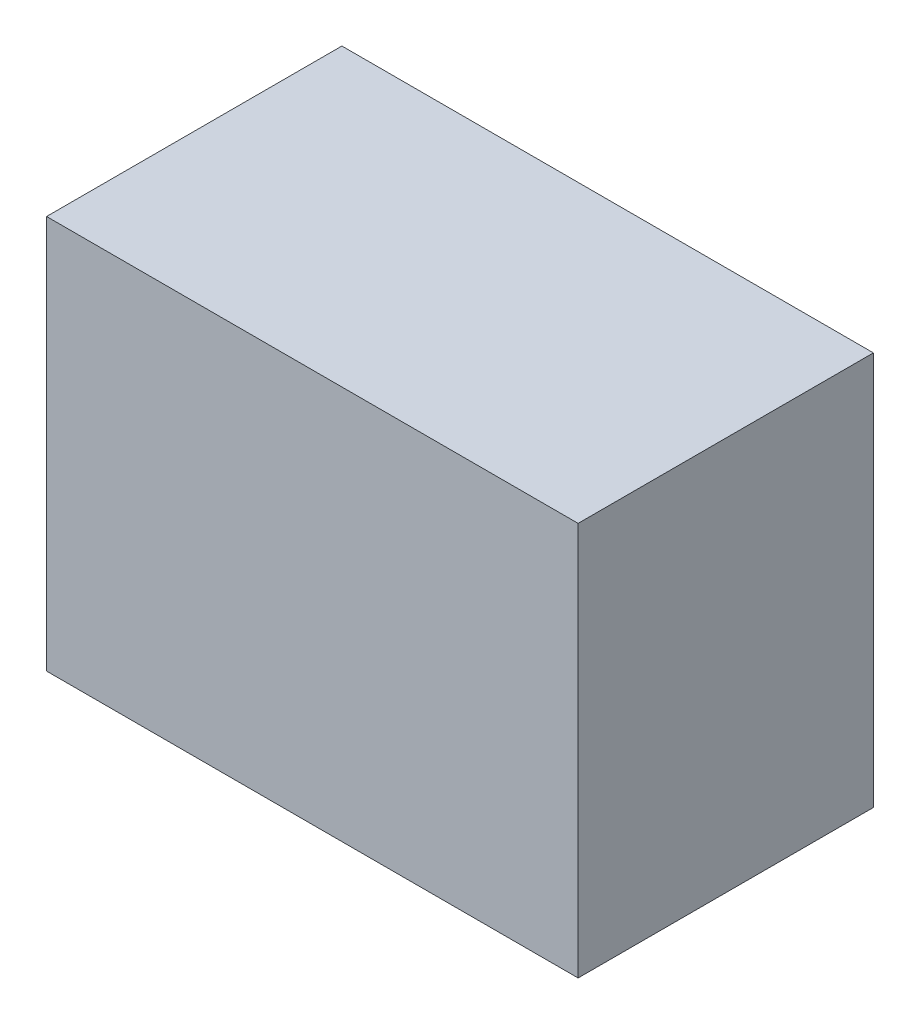
ISO-10303-21;
HEADER;
FILE_DESCRIPTION(('STEP AP214'),'2;1');
FILE_NAME('part.step','',(''),(''),'','','');
FILE_SCHEMA(('AUTOMOTIVE_DESIGN { 1 0 10303 214 1 1 1 1 }'));
ENDSEC;
DATA;
#1=APPLICATION_CONTEXT('core data for automotive mechanical design processes');
#2=APPLICATION_PROTOCOL_DEFINITION('international standard','automotive_design',2000,#1);
#3=PRODUCT_CONTEXT('',#1,'mechanical');
#4=PRODUCT('Part','Part','',(#3));
#5=PRODUCT_RELATED_PRODUCT_CATEGORY('part','',(#4));
#6=PRODUCT_DEFINITION_FORMATION('','',#4);
#7=PRODUCT_DEFINITION_CONTEXT('part definition',#1,'design');
#8=PRODUCT_DEFINITION('design','',#6,#7);
#9=PRODUCT_DEFINITION_SHAPE('','',#8);
#10=(LENGTH_UNIT() NAMED_UNIT(*) SI_UNIT(.MILLI.,.METRE.));
#11=(NAMED_UNIT(*) PLANE_ANGLE_UNIT() SI_UNIT($,.RADIAN.));
#12=(NAMED_UNIT(*) SI_UNIT($,.STERADIAN.) SOLID_ANGLE_UNIT());
#13=UNCERTAINTY_MEASURE_WITH_UNIT(LENGTH_MEASURE(1.E-05),#10,'distance_accuracy_value','');
#14=(GEOMETRIC_REPRESENTATION_CONTEXT(3) GLOBAL_UNCERTAINTY_ASSIGNED_CONTEXT((#13)) GLOBAL_UNIT_ASSIGNED_CONTEXT((#10,
#11,#12)) REPRESENTATION_CONTEXT('',''));
#15=CARTESIAN_POINT('',(0.,0.,0.));
#16=DIRECTION('',(0.,0.,1.));
#17=DIRECTION('',(1.,0.,0.));
#18=AXIS2_PLACEMENT_3D('',#15,#16,#17);
#19=CARTESIAN_POINT('',(-135.,191.758567393963,-75.));
#20=DIRECTION('',(1.,0.,0.));
#21=DIRECTION('',(0.,0.,-1.));
#22=AXIS2_PLACEMENT_3D('',#19,#20,#21);
#23=PLANE('',#22);
#24=DIRECTION('',(0.,0.,1.));
#25=VECTOR('',#24,1.);
#26=CARTESIAN_POINT('',(-135.,-8.24143260603705,-75.));
#27=LINE('',#26,#25);
#28=CARTESIAN_POINT('',(-135.,-8.24143260603705,-75.));
#29=VERTEX_POINT('',#28);
#30=CARTESIAN_POINT('',(-135.,-8.24143260603705,75.));
#31=VERTEX_POINT('',#30);
#32=EDGE_CURVE('E101',#29,#31,#27,.T.);
#33=ORIENTED_EDGE('',*,*,#32,.T.);
#34=DIRECTION('',(0.,-1.,0.));
#35=VECTOR('',#34,1.);
#36=CARTESIAN_POINT('',(-135.,191.758567393963,75.));
#37=LINE('',#36,#35);
#38=CARTESIAN_POINT('',(-135.,191.758567393963,75.));
#39=VERTEX_POINT('',#38);
#40=EDGE_CURVE('E11',#39,#31,#37,.T.);
#41=ORIENTED_EDGE('',*,*,#40,.F.);
#42=DIRECTION('',(0.,0.,1.));
#43=VECTOR('',#42,1.);
#44=CARTESIAN_POINT('',(-135.,191.758567393963,-75.));
#45=LINE('',#44,#43);
#46=CARTESIAN_POINT('',(-135.,191.758567393963,-75.));
#47=VERTEX_POINT('',#46);
#48=EDGE_CURVE('E89',#47,#39,#45,.T.);
#49=ORIENTED_EDGE('',*,*,#48,.F.);
#50=DIRECTION('',(0.,-1.,0.));
#51=VECTOR('',#50,1.);
#52=CARTESIAN_POINT('',(-135.,191.758567393963,-75.));
#53=LINE('',#52,#51);
#54=EDGE_CURVE('E97',#47,#29,#53,.T.);
#55=ORIENTED_EDGE('',*,*,#54,.T.);
#56=EDGE_LOOP('',(#33,#41,#49,#55));
#57=FACE_BOUND('',#56,.T.);
#58=ADVANCED_FACE('F38',(#57),#23,.F.);
#59=CARTESIAN_POINT('',(135.,191.758567393963,75.));
#60=DIRECTION('',(0.,0.,-1.));
#61=DIRECTION('',(-1.,0.,0.));
#62=AXIS2_PLACEMENT_3D('',#59,#60,#61);
#63=PLANE('',#62);
#64=DIRECTION('',(1.,0.,0.));
#65=VECTOR('',#64,1.);
#66=CARTESIAN_POINT('',(135.,-8.24143260603705,75.));
#67=LINE('',#66,#65);
#68=CARTESIAN_POINT('',(135.,-8.24143260603705,75.));
#69=VERTEX_POINT('',#68);
#70=EDGE_CURVE('E93',#31,#69,#67,.T.);
#71=ORIENTED_EDGE('',*,*,#70,.T.);
#72=DIRECTION('',(0.,-1.,0.));
#73=VECTOR('',#72,1.);
#74=CARTESIAN_POINT('',(135.,191.758567393963,75.));
#75=LINE('',#74,#73);
#76=CARTESIAN_POINT('',(135.,191.758567393963,75.));
#77=VERTEX_POINT('',#76);
#78=EDGE_CURVE('E46',#77,#69,#75,.T.);
#79=ORIENTED_EDGE('',*,*,#78,.F.);
#80=DIRECTION('',(1.,0.,0.));
#81=VECTOR('',#80,1.);
#82=CARTESIAN_POINT('',(135.,191.758567393963,75.));
#83=LINE('',#82,#81);
#84=EDGE_CURVE('E84',#39,#77,#83,.T.);
#85=ORIENTED_EDGE('',*,*,#84,.F.);
#86=ORIENTED_EDGE('',*,*,#40,.T.);
#87=EDGE_LOOP('',(#71,#79,#85,#86));
#88=FACE_BOUND('',#87,.T.);
#89=ADVANCED_FACE('F92',(#88),#63,.F.);
#90=CARTESIAN_POINT('',(135.,191.758567393963,-75.));
#91=DIRECTION('',(-1.,0.,0.));
#92=DIRECTION('',(0.,0.,1.));
#93=AXIS2_PLACEMENT_3D('',#90,#91,#92);
#94=PLANE('',#93);
#95=DIRECTION('',(0.,0.,-1.));
#96=VECTOR('',#95,1.);
#97=CARTESIAN_POINT('',(135.,-8.24143260603705,-75.));
#98=LINE('',#97,#96);
#99=CARTESIAN_POINT('',(135.,-8.24143260603705,-75.));
#100=VERTEX_POINT('',#99);
#101=EDGE_CURVE('E71',#69,#100,#98,.T.);
#102=ORIENTED_EDGE('',*,*,#101,.T.);
#103=DIRECTION('',(0.,-1.,0.));
#104=VECTOR('',#103,1.);
#105=CARTESIAN_POINT('',(135.,191.758567393963,-75.));
#106=LINE('',#105,#104);
#107=CARTESIAN_POINT('',(135.,191.758567393963,-75.));
#108=VERTEX_POINT('',#107);
#109=EDGE_CURVE('E94',#108,#100,#106,.T.);
#110=ORIENTED_EDGE('',*,*,#109,.F.);
#111=DIRECTION('',(0.,0.,-1.));
#112=VECTOR('',#111,1.);
#113=CARTESIAN_POINT('',(135.,191.758567393963,-75.));
#114=LINE('',#113,#112);
#115=EDGE_CURVE('E87',#77,#108,#114,.T.);
#116=ORIENTED_EDGE('',*,*,#115,.F.);
#117=ORIENTED_EDGE('',*,*,#78,.T.);
#118=EDGE_LOOP('',(#102,#110,#116,#117));
#119=FACE_BOUND('',#118,.T.);
#120=ADVANCED_FACE('F95',(#119),#94,.F.);
#121=CARTESIAN_POINT('',(135.,191.758567393963,-75.));
#122=DIRECTION('',(0.,0.,1.));
#123=DIRECTION('',(1.,0.,0.));
#124=AXIS2_PLACEMENT_3D('',#121,#122,#123);
#125=PLANE('',#124);
#126=DIRECTION('',(-1.,0.,0.));
#127=VECTOR('',#126,1.);
#128=CARTESIAN_POINT('',(135.,-8.24143260603705,-75.));
#129=LINE('',#128,#127);
#130=EDGE_CURVE('E77',#100,#29,#129,.T.);
#131=ORIENTED_EDGE('',*,*,#130,.T.);
#132=ORIENTED_EDGE('',*,*,#54,.F.);
#133=DIRECTION('',(-1.,0.,0.));
#134=VECTOR('',#133,1.);
#135=CARTESIAN_POINT('',(135.,191.758567393963,-75.));
#136=LINE('',#135,#134);
#137=EDGE_CURVE('E54',#108,#47,#136,.T.);
#138=ORIENTED_EDGE('',*,*,#137,.F.);
#139=ORIENTED_EDGE('',*,*,#109,.T.);
#140=EDGE_LOOP('',(#131,#132,#138,#139));
#141=FACE_BOUND('',#140,.T.);
#142=ADVANCED_FACE('F108',(#141),#125,.F.);
#143=CARTESIAN_POINT('',(0.,191.758567393963,0.));
#144=DIRECTION('',(0.,-1.,0.));
#145=DIRECTION('',(0.,0.,-1.));
#146=AXIS2_PLACEMENT_3D('',#143,#144,#145);
#147=PLANE('',#146);
#148=ORIENTED_EDGE('',*,*,#48,.T.);
#149=ORIENTED_EDGE('',*,*,#84,.T.);
#150=ORIENTED_EDGE('',*,*,#115,.T.);
#151=ORIENTED_EDGE('',*,*,#137,.T.);
#152=EDGE_LOOP('',(#148,#149,#150,#151));
#153=FACE_BOUND('',#152,.T.);
#154=ADVANCED_FACE('F85',(#153),#147,.F.);
#155=CARTESIAN_POINT('',(0.,-8.24143260603705,0.));
#156=DIRECTION('',(0.,-1.,0.));
#157=DIRECTION('',(0.,0.,-1.));
#158=AXIS2_PLACEMENT_3D('',#155,#156,#157);
#159=PLANE('',#158);
#160=ORIENTED_EDGE('',*,*,#32,.F.);
#161=ORIENTED_EDGE('',*,*,#130,.F.);
#162=ORIENTED_EDGE('',*,*,#101,.F.);
#163=ORIENTED_EDGE('',*,*,#70,.F.);
#164=EDGE_LOOP('',(#160,#161,#162,#163));
#165=FACE_BOUND('',#164,.T.);
#166=ADVANCED_FACE('F111',(#165),#159,.T.);
#167=CLOSED_SHELL('',(#58,#89,#120,#142,#154,#166));
#168=MANIFOLD_SOLID_BREP('B2',#167);
#169=ADVANCED_BREP_SHAPE_REPRESENTATION('',(#18,#168),#14);
#170=SHAPE_DEFINITION_REPRESENTATION(#9,#169);
ENDSEC;
END-ISO-10303-21;
